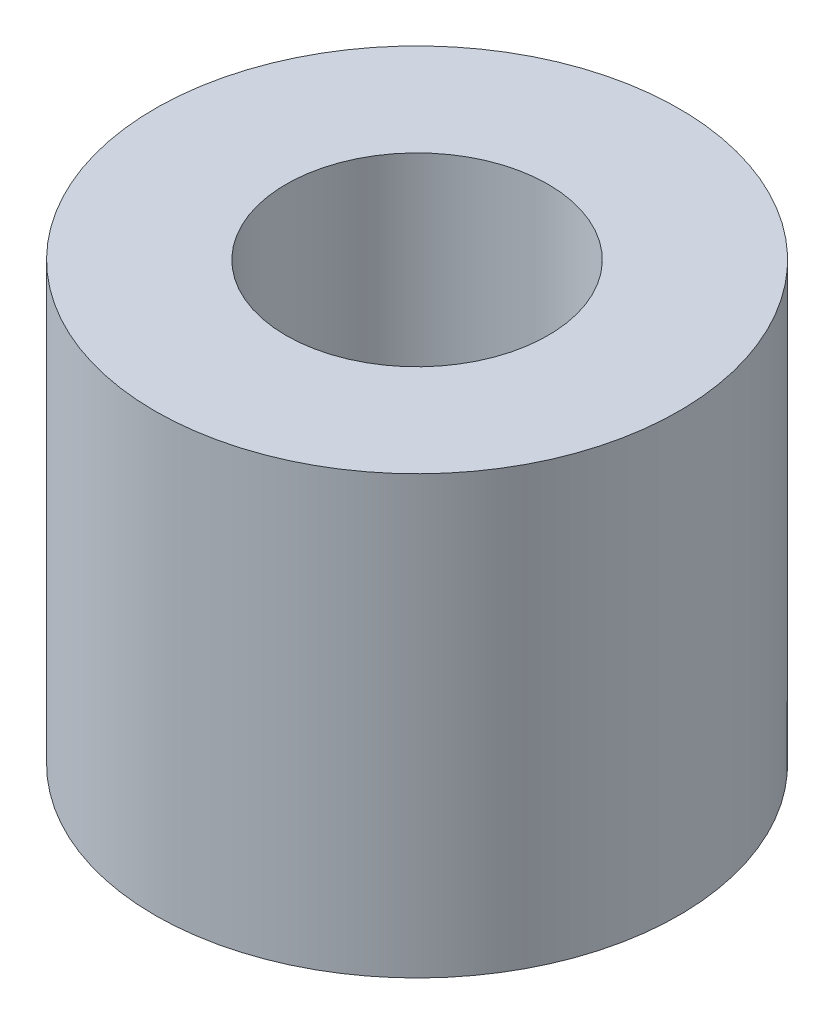
ISO-10303-21;
HEADER;
FILE_DESCRIPTION(('STEP AP214'),'2;1');
FILE_NAME('part.step','',(''),(''),'','','');
FILE_SCHEMA(('AUTOMOTIVE_DESIGN { 1 0 10303 214 1 1 1 1 }'));
ENDSEC;
DATA;
#1=APPLICATION_CONTEXT('core data for automotive mechanical design processes');
#2=APPLICATION_PROTOCOL_DEFINITION('international standard','automotive_design',2000,#1);
#3=PRODUCT_CONTEXT('',#1,'mechanical');
#4=PRODUCT('Part','Part','',(#3));
#5=PRODUCT_RELATED_PRODUCT_CATEGORY('part','',(#4));
#6=PRODUCT_DEFINITION_FORMATION('','',#4);
#7=PRODUCT_DEFINITION_CONTEXT('part definition',#1,'design');
#8=PRODUCT_DEFINITION('design','',#6,#7);
#9=PRODUCT_DEFINITION_SHAPE('','',#8);
#10=(LENGTH_UNIT() NAMED_UNIT(*) SI_UNIT(.MILLI.,.METRE.));
#11=(NAMED_UNIT(*) PLANE_ANGLE_UNIT() SI_UNIT($,.RADIAN.));
#12=(NAMED_UNIT(*) SI_UNIT($,.STERADIAN.) SOLID_ANGLE_UNIT());
#13=UNCERTAINTY_MEASURE_WITH_UNIT(LENGTH_MEASURE(1.E-05),#10,'distance_accuracy_value','');
#14=(GEOMETRIC_REPRESENTATION_CONTEXT(3) GLOBAL_UNCERTAINTY_ASSIGNED_CONTEXT((#13)) GLOBAL_UNIT_ASSIGNED_CONTEXT((#10,
#11,#12)) REPRESENTATION_CONTEXT('',''));
#15=CARTESIAN_POINT('',(0.,0.,0.));
#16=DIRECTION('',(0.,0.,1.));
#17=DIRECTION('',(1.,0.,0.));
#18=AXIS2_PLACEMENT_3D('',#15,#16,#17);
#19=CARTESIAN_POINT('',(0.,5.,0.));
#20=DIRECTION('',(0.,1.,0.));
#21=DIRECTION('',(0.,0.,1.));
#22=AXIS2_PLACEMENT_3D('',#19,#20,#21);
#23=PLANE('',#22);
#24=CARTESIAN_POINT('',(0.,5.,0.));
#25=DIRECTION('',(0.,1.,0.));
#26=DIRECTION('',(0.,0.,1.));
#27=AXIS2_PLACEMENT_3D('',#24,#25,#26);
#28=CIRCLE('',#27,3.);
#29=CARTESIAN_POINT('',(0.,5.,3.));
#30=VERTEX_POINT('',#29);
#31=EDGE_CURVE('E10',#30,#30,#28,.T.);
#32=ORIENTED_EDGE('',*,*,#31,.T.);
#33=EDGE_LOOP('',(#32));
#34=FACE_BOUND('',#33,.T.);
#35=CARTESIAN_POINT('',(0.,5.,0.));
#36=DIRECTION('',(0.,1.,0.));
#37=DIRECTION('',(0.,0.,1.));
#38=AXIS2_PLACEMENT_3D('',#35,#36,#37);
#39=CIRCLE('',#38,1.5);
#40=CARTESIAN_POINT('',(0.,5.,1.5));
#41=VERTEX_POINT('',#40);
#42=EDGE_CURVE('E43',#41,#41,#39,.T.);
#43=ORIENTED_EDGE('',*,*,#42,.F.);
#44=EDGE_LOOP('',(#43));
#45=FACE_BOUND('',#44,.T.);
#46=ADVANCED_FACE('F32',(#34,#45),#23,.T.);
#47=CARTESIAN_POINT('',(0.,0.,0.));
#48=DIRECTION('',(0.,1.,0.));
#49=DIRECTION('',(0.,0.,1.));
#50=AXIS2_PLACEMENT_3D('',#47,#48,#49);
#51=PLANE('',#50);
#52=CARTESIAN_POINT('',(0.,0.,0.));
#53=DIRECTION('',(0.,1.,0.));
#54=DIRECTION('',(0.,0.,1.));
#55=AXIS2_PLACEMENT_3D('',#52,#53,#54);
#56=CIRCLE('',#55,3.);
#57=CARTESIAN_POINT('',(0.,0.,3.));
#58=VERTEX_POINT('',#57);
#59=EDGE_CURVE('E36',#58,#58,#56,.T.);
#60=ORIENTED_EDGE('',*,*,#59,.F.);
#61=EDGE_LOOP('',(#60));
#62=FACE_BOUND('',#61,.T.);
#63=CARTESIAN_POINT('',(0.,0.,0.));
#64=DIRECTION('',(0.,1.,0.));
#65=DIRECTION('',(0.,0.,1.));
#66=AXIS2_PLACEMENT_3D('',#63,#64,#65);
#67=CIRCLE('',#66,1.5);
#68=CARTESIAN_POINT('',(0.,0.,1.5));
#69=VERTEX_POINT('',#68);
#70=EDGE_CURVE('E45',#69,#69,#67,.T.);
#71=ORIENTED_EDGE('',*,*,#70,.T.);
#72=EDGE_LOOP('',(#71));
#73=FACE_BOUND('',#72,.T.);
#74=ADVANCED_FACE('F55',(#62,#73),#51,.F.);
#75=CARTESIAN_POINT('',(0.,5.,0.));
#76=DIRECTION('',(0.,-1.,0.));
#77=DIRECTION('',(0.,0.,-1.));
#78=AXIS2_PLACEMENT_3D('',#75,#76,#77);
#79=CYLINDRICAL_SURFACE('',#78,3.);
#80=ORIENTED_EDGE('',*,*,#31,.F.);
#81=EDGE_LOOP('',(#80));
#82=FACE_BOUND('',#81,.T.);
#83=ORIENTED_EDGE('',*,*,#59,.T.);
#84=EDGE_LOOP('',(#83));
#85=FACE_BOUND('',#84,.T.);
#86=ADVANCED_FACE('F34',(#82,#85),#79,.T.);
#87=CARTESIAN_POINT('',(0.,5.,0.));
#88=DIRECTION('',(0.,-1.,0.));
#89=DIRECTION('',(0.,0.,-1.));
#90=AXIS2_PLACEMENT_3D('',#87,#88,#89);
#91=CYLINDRICAL_SURFACE('',#90,1.5);
#92=ORIENTED_EDGE('',*,*,#42,.T.);
#93=EDGE_LOOP('',(#92));
#94=FACE_BOUND('',#93,.T.);
#95=ORIENTED_EDGE('',*,*,#70,.F.);
#96=EDGE_LOOP('',(#95));
#97=FACE_BOUND('',#96,.T.);
#98=ADVANCED_FACE('F51',(#94,#97),#91,.F.);
#99=CLOSED_SHELL('',(#46,#74,#86,#98));
#100=MANIFOLD_SOLID_BREP('B2',#99);
#101=ADVANCED_BREP_SHAPE_REPRESENTATION('',(#18,#100),#14);
#102=SHAPE_DEFINITION_REPRESENTATION(#9,#101);
ENDSEC;
END-ISO-10303-21;
